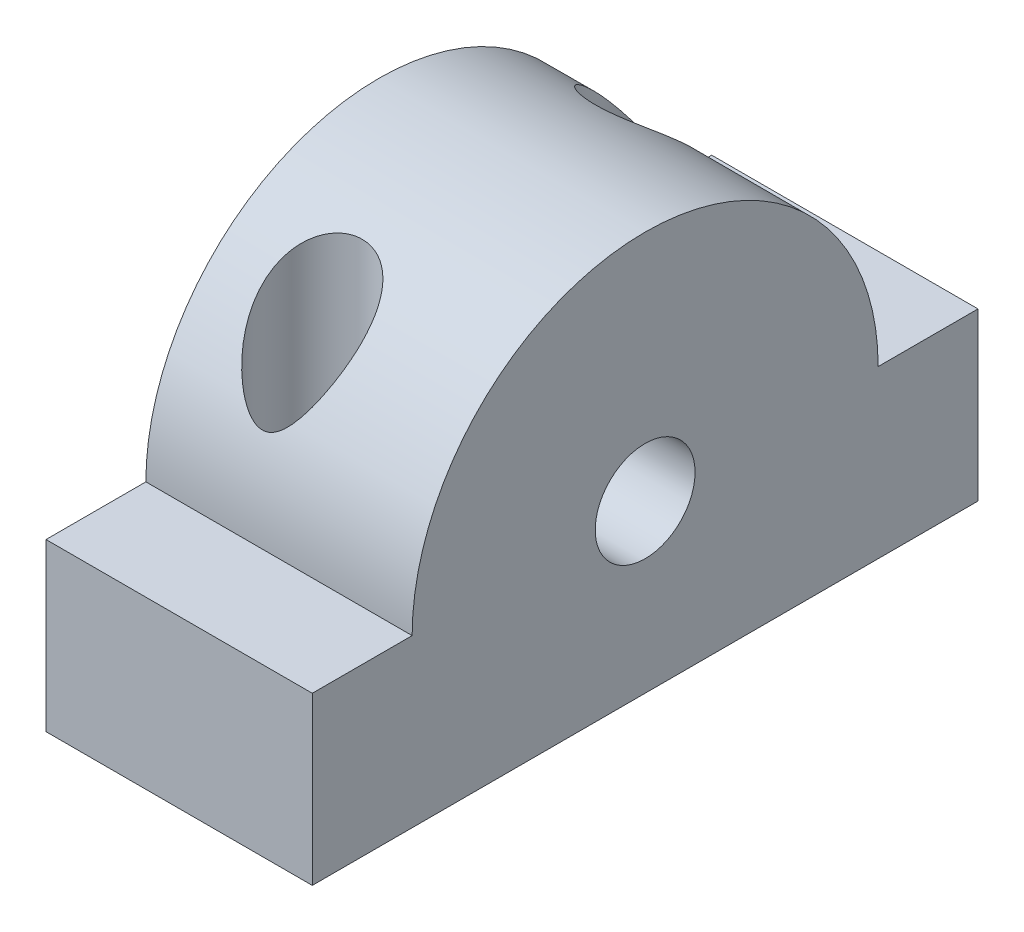
ISO-10303-21;
HEADER;
FILE_DESCRIPTION(('STEP AP214'),'2;1');
FILE_NAME('part.step','',(''),(''),'','','');
FILE_SCHEMA(('AUTOMOTIVE_DESIGN { 1 0 10303 214 1 1 1 1 }'));
ENDSEC;
DATA;
#1=APPLICATION_CONTEXT('core data for automotive mechanical design processes');
#2=APPLICATION_PROTOCOL_DEFINITION('international standard','automotive_design',2000,#1);
#3=PRODUCT_CONTEXT('',#1,'mechanical');
#4=PRODUCT('Part','Part','',(#3));
#5=PRODUCT_RELATED_PRODUCT_CATEGORY('part','',(#4));
#6=PRODUCT_DEFINITION_FORMATION('','',#4);
#7=PRODUCT_DEFINITION_CONTEXT('part definition',#1,'design');
#8=PRODUCT_DEFINITION('design','',#6,#7);
#9=PRODUCT_DEFINITION_SHAPE('','',#8);
#10=(LENGTH_UNIT() NAMED_UNIT(*) SI_UNIT(.MILLI.,.METRE.));
#11=(NAMED_UNIT(*) PLANE_ANGLE_UNIT() SI_UNIT($,.RADIAN.));
#12=(NAMED_UNIT(*) SI_UNIT($,.STERADIAN.) SOLID_ANGLE_UNIT());
#13=UNCERTAINTY_MEASURE_WITH_UNIT(LENGTH_MEASURE(1.E-05),#10,'distance_accuracy_value','');
#14=(GEOMETRIC_REPRESENTATION_CONTEXT(3) GLOBAL_UNCERTAINTY_ASSIGNED_CONTEXT((#13)) GLOBAL_UNIT_ASSIGNED_CONTEXT((#10,
#11,#12)) REPRESENTATION_CONTEXT('',''));
#15=CARTESIAN_POINT('',(0.,0.,0.));
#16=DIRECTION('',(0.,0.,1.));
#17=DIRECTION('',(1.,0.,0.));
#18=AXIS2_PLACEMENT_3D('',#15,#16,#17);
#19=CARTESIAN_POINT('',(8.,0.,0.));
#20=DIRECTION('',(0.,0.,-1.));
#21=DIRECTION('',(-1.,0.,0.));
#22=AXIS2_PLACEMENT_3D('',#19,#20,#21);
#23=PLANE('',#22);
#24=DIRECTION('',(0.,-1.,0.));
#25=VECTOR('',#24,1.);
#26=CARTESIAN_POINT('',(0.,0.,0.));
#27=LINE('',#26,#25);
#28=CARTESIAN_POINT('',(0.,0.,0.));
#29=VERTEX_POINT('',#28);
#30=CARTESIAN_POINT('',(0.,-5.,0.));
#31=VERTEX_POINT('',#30);
#32=EDGE_CURVE('E131',#29,#31,#27,.T.);
#33=ORIENTED_EDGE('',*,*,#32,.T.);
#34=DIRECTION('',(-1.,0.,0.));
#35=VECTOR('',#34,1.);
#36=CARTESIAN_POINT('',(8.,-5.,0.));
#37=LINE('',#36,#35);
#38=CARTESIAN_POINT('',(8.,-5.,0.));
#39=VERTEX_POINT('',#38);
#40=EDGE_CURVE('E11',#39,#31,#37,.T.);
#41=ORIENTED_EDGE('',*,*,#40,.F.);
#42=DIRECTION('',(0.,-1.,0.));
#43=VECTOR('',#42,1.);
#44=CARTESIAN_POINT('',(8.,0.,0.));
#45=LINE('',#44,#43);
#46=CARTESIAN_POINT('',(8.,0.,0.));
#47=VERTEX_POINT('',#46);
#48=EDGE_CURVE('E142',#47,#39,#45,.T.);
#49=ORIENTED_EDGE('',*,*,#48,.F.);
#50=DIRECTION('',(-1.,0.,0.));
#51=VECTOR('',#50,1.);
#52=CARTESIAN_POINT('',(8.,0.,0.));
#53=LINE('',#52,#51);
#54=EDGE_CURVE('E127',#47,#29,#53,.T.);
#55=ORIENTED_EDGE('',*,*,#54,.T.);
#56=EDGE_LOOP('',(#33,#41,#49,#55));
#57=FACE_BOUND('',#56,.T.);
#58=ADVANCED_FACE('F45',(#57),#23,.F.);
#59=CARTESIAN_POINT('',(8.,-5.,0.));
#60=DIRECTION('',(0.,1.,0.));
#61=DIRECTION('',(0.,0.,1.));
#62=AXIS2_PLACEMENT_3D('',#59,#60,#61);
#63=PLANE('',#62);
#64=CARTESIAN_POINT('',(3.,-5.,-5.));
#65=DIRECTION('',(0.,-1.,0.));
#66=DIRECTION('',(0.,0.,-1.));
#67=AXIS2_PLACEMENT_3D('',#64,#65,#66);
#68=CIRCLE('',#67,1.5);
#69=CARTESIAN_POINT('',(3.,-5.,-6.5));
#70=VERTEX_POINT('',#69);
#71=EDGE_CURVE('E155',#70,#70,#68,.T.);
#72=ORIENTED_EDGE('',*,*,#71,.F.);
#73=EDGE_LOOP('',(#72));
#74=FACE_BOUND('',#73,.T.);
#75=CARTESIAN_POINT('',(3.,-5.,-15.));
#76=DIRECTION('',(0.,-1.,0.));
#77=DIRECTION('',(0.,0.,1.));
#78=AXIS2_PLACEMENT_3D('',#75,#76,#77);
#79=CIRCLE('',#78,1.5);
#80=CARTESIAN_POINT('',(3.,-5.,-13.5));
#81=VERTEX_POINT('',#80);
#82=EDGE_CURVE('E202',#81,#81,#79,.T.);
#83=ORIENTED_EDGE('',*,*,#82,.F.);
#84=EDGE_LOOP('',(#83));
#85=FACE_BOUND('',#84,.T.);
#86=DIRECTION('',(0.,0.,-1.));
#87=VECTOR('',#86,1.);
#88=CARTESIAN_POINT('',(0.,-5.,0.));
#89=LINE('',#88,#87);
#90=CARTESIAN_POINT('',(0.,-5.,-20.));
#91=VERTEX_POINT('',#90);
#92=EDGE_CURVE('E134',#31,#91,#89,.T.);
#93=ORIENTED_EDGE('',*,*,#92,.T.);
#94=DIRECTION('',(-1.,0.,0.));
#95=VECTOR('',#94,1.);
#96=CARTESIAN_POINT('',(8.,-5.,-20.));
#97=LINE('',#96,#95);
#98=CARTESIAN_POINT('',(8.,-5.,-20.));
#99=VERTEX_POINT('',#98);
#100=EDGE_CURVE('E54',#99,#91,#97,.T.);
#101=ORIENTED_EDGE('',*,*,#100,.F.);
#102=DIRECTION('',(0.,0.,-1.));
#103=VECTOR('',#102,1.);
#104=CARTESIAN_POINT('',(8.,-5.,0.));
#105=LINE('',#104,#103);
#106=EDGE_CURVE('E100',#39,#99,#105,.T.);
#107=ORIENTED_EDGE('',*,*,#106,.F.);
#108=ORIENTED_EDGE('',*,*,#40,.T.);
#109=EDGE_LOOP('',(#93,#101,#107,#108));
#110=FACE_BOUND('',#109,.T.);
#111=ADVANCED_FACE('F186',(#74,#85,#110),#63,.F.);
#112=CARTESIAN_POINT('',(8.,0.,-20.));
#113=DIRECTION('',(0.,0.,1.));
#114=DIRECTION('',(1.,0.,0.));
#115=AXIS2_PLACEMENT_3D('',#112,#113,#114);
#116=PLANE('',#115);
#117=DIRECTION('',(0.,1.,0.));
#118=VECTOR('',#117,1.);
#119=CARTESIAN_POINT('',(0.,0.,-20.));
#120=LINE('',#119,#118);
#121=CARTESIAN_POINT('',(0.,0.,-20.));
#122=VERTEX_POINT('',#121);
#123=EDGE_CURVE('E137',#91,#122,#120,.T.);
#124=ORIENTED_EDGE('',*,*,#123,.T.);
#125=DIRECTION('',(-1.,0.,0.));
#126=VECTOR('',#125,1.);
#127=CARTESIAN_POINT('',(8.,0.,-20.));
#128=LINE('',#127,#126);
#129=CARTESIAN_POINT('',(8.,0.,-20.));
#130=VERTEX_POINT('',#129);
#131=EDGE_CURVE('E122',#130,#122,#128,.T.);
#132=ORIENTED_EDGE('',*,*,#131,.F.);
#133=DIRECTION('',(0.,1.,0.));
#134=VECTOR('',#133,1.);
#135=CARTESIAN_POINT('',(8.,0.,-20.));
#136=LINE('',#135,#134);
#137=EDGE_CURVE('E113',#99,#130,#136,.T.);
#138=ORIENTED_EDGE('',*,*,#137,.F.);
#139=ORIENTED_EDGE('',*,*,#100,.T.);
#140=EDGE_LOOP('',(#124,#132,#138,#139));
#141=FACE_BOUND('',#140,.T.);
#142=ADVANCED_FACE('F191',(#141),#116,.F.);
#143=CARTESIAN_POINT('',(8.,0.,-17.));
#144=DIRECTION('',(0.,-1.,0.));
#145=DIRECTION('',(0.,0.,-1.));
#146=AXIS2_PLACEMENT_3D('',#143,#144,#145);
#147=PLANE('',#146);
#148=DIRECTION('',(0.,0.,1.));
#149=VECTOR('',#148,1.);
#150=CARTESIAN_POINT('',(0.,0.,-17.));
#151=LINE('',#150,#149);
#152=CARTESIAN_POINT('',(0.,0.,-17.));
#153=VERTEX_POINT('',#152);
#154=EDGE_CURVE('E121',#122,#153,#151,.T.);
#155=ORIENTED_EDGE('',*,*,#154,.T.);
#156=DIRECTION('',(-1.,0.,0.));
#157=VECTOR('',#156,1.);
#158=CARTESIAN_POINT('',(8.,0.,-17.));
#159=LINE('',#158,#157);
#160=CARTESIAN_POINT('',(8.,0.,-17.));
#161=VERTEX_POINT('',#160);
#162=EDGE_CURVE('E118',#161,#153,#159,.T.);
#163=ORIENTED_EDGE('',*,*,#162,.F.);
#164=DIRECTION('',(0.,0.,1.));
#165=VECTOR('',#164,1.);
#166=CARTESIAN_POINT('',(8.,0.,-17.));
#167=LINE('',#166,#165);
#168=EDGE_CURVE('E107',#130,#161,#167,.T.);
#169=ORIENTED_EDGE('',*,*,#168,.F.);
#170=ORIENTED_EDGE('',*,*,#131,.T.);
#171=EDGE_LOOP('',(#155,#163,#169,#170));
#172=FACE_BOUND('',#171,.T.);
#173=ADVANCED_FACE('F119',(#172),#147,.F.);
#174=CARTESIAN_POINT('',(8.,0.,-10.));
#175=DIRECTION('',(-1.,0.,0.));
#176=DIRECTION('',(0.,0.,1.));
#177=AXIS2_PLACEMENT_3D('',#174,#175,#176);
#178=CYLINDRICAL_SURFACE('',#177,7.);
#179=CARTESIAN_POINT('',(3.,6.06217782649107,-6.5));
#180=CARTESIAN_POINT('',(3.07488724612899,6.06217677462976,-6.49999634374938));
#181=CARTESIAN_POINT('',(3.14988624091181,6.0589302713698,-6.49435644566424));
#182=CARTESIAN_POINT('',(3.29775974677453,6.0459724803858,-6.47205774478669));
#183=CARTESIAN_POINT('',(3.37062905275264,6.03624654463625,-6.45537397570824));
#184=CARTESIAN_POINT('',(3.51188865566737,6.01049479681937,-6.41188299750404));
#185=CARTESIAN_POINT('',(3.58029019650692,5.9944855713019,-6.38510244900321));
#186=CARTESIAN_POINT('',(3.71106599554074,5.95643101131848,-6.32273786800935));
#187=CARTESIAN_POINT('',(3.77344269810746,5.93438813883361,-6.28715742681158));
#188=CARTESIAN_POINT('',(3.89292525958971,5.88379941758364,-6.20748150702812));
#189=CARTESIAN_POINT('',(3.94978516839445,5.85506078959614,-6.1631411109325));
#190=CARTESIAN_POINT('',(4.05496144917599,5.79205373694304,-6.06867227857916));
#191=CARTESIAN_POINT('',(4.10327468693715,5.75778329243689,-6.01854173006338));
#192=CARTESIAN_POINT('',(4.19602252113023,5.68016067501728,-5.90844851594702));
#193=CARTESIAN_POINT('',(4.23940177401288,5.63621985297474,-5.84801495280211));
#194=CARTESIAN_POINT('',(4.315428429894,5.54312300713837,-5.72451251700034));
#195=CARTESIAN_POINT('',(4.34806891256743,5.49396364727133,-5.66144197439642));
#196=CARTESIAN_POINT('',(4.4167546955706,5.36613782400882,-5.50341581278758));
#197=CARTESIAN_POINT('',(4.44666359778181,5.2847950322343,-5.40794604740489));
#198=CARTESIAN_POINT('',(4.48702326248985,5.11482709893844,-5.21933503664093));
#199=CARTESIAN_POINT('',(4.49743163483481,5.02618652885623,-5.12619929722758));
#200=CARTESIAN_POINT('',(4.50104902374122,4.87255488254904,-4.97347088141769));
#201=CARTESIAN_POINT('',(4.49864351739466,4.80891094018342,-4.91255459865941));
#202=CARTESIAN_POINT('',(4.48691798287046,4.67971570857437,-4.79346831181909));
#203=CARTESIAN_POINT('',(4.4775975223072,4.61416430030517,-4.73529847971197));
#204=CARTESIAN_POINT('',(4.45273959729481,4.48154486847538,-4.6219540018488));
#205=CARTESIAN_POINT('',(4.43719432490148,4.41447504038028,-4.56678321695874));
#206=CARTESIAN_POINT('',(4.40045785583339,4.27931491601703,-4.45970247839746));
#207=CARTESIAN_POINT('',(4.37926743029367,4.21122476032494,-4.4077920805492));
#208=CARTESIAN_POINT('',(4.33095803210965,4.07240049920133,-4.30586401596733));
#209=CARTESIAN_POINT('',(4.30368372443732,4.00164732927497,-4.25594618178696));
#210=CARTESIAN_POINT('',(4.24386068990434,3.85989916659202,-4.15975035645615));
#211=CARTESIAN_POINT('',(4.21131180482271,3.78890416664384,-4.11347247455487));
#212=CARTESIAN_POINT('',(4.14098406635786,3.64716476638046,-4.02461879109314));
#213=CARTESIAN_POINT('',(4.10320460699923,3.57642039607669,-3.98204341940978));
#214=CARTESIAN_POINT('',(4.02220307231857,3.43591555156199,-3.90073146296065));
#215=CARTESIAN_POINT('',(3.97898388887663,3.36615457630842,-3.86199285789354));
#216=CARTESIAN_POINT('',(3.8798090265835,3.21864912727658,-3.78323181836819));
#217=CARTESIAN_POINT('',(3.82291578996759,3.14119045536872,-3.74381869853061));
#218=CARTESIAN_POINT('',(3.73015307569975,3.0291543535705,-3.68921869834723));
#219=CARTESIAN_POINT('',(3.6980432869428,2.99254753229684,-3.67179243844725));
#220=CARTESIAN_POINT('',(3.63088846263601,2.92134191886284,-3.63860900282595));
#221=CARTESIAN_POINT('',(3.59584586051998,2.88674150151201,-3.62285046746037));
#222=CARTESIAN_POINT('',(3.52621368996409,2.82409961021022,-3.59488413495186));
#223=CARTESIAN_POINT('',(3.4919823889331,2.79575315285715,-3.58247669824057));
#224=CARTESIAN_POINT('',(3.42022037285386,2.74257567142704,-3.5595719159984));
#225=CARTESIAN_POINT('',(3.38268960969438,2.71774469862497,-3.54907459832685));
#226=CARTESIAN_POINT('',(3.30970845793241,2.67662176252767,-3.53191530166755));
#227=CARTESIAN_POINT('',(3.27475031859164,2.65961299069627,-3.5249174757353));
#228=CARTESIAN_POINT('',(3.20230836225991,2.63104470432912,-3.51325622013703));
#229=CARTESIAN_POINT('',(3.16483069686261,2.61947243167818,-3.50858732344287));
#230=CARTESIAN_POINT('',(3.0952089702251,2.60481996245347,-3.50269560855217));
#231=CARTESIAN_POINT('',(3.06335642997214,2.60056698943998,-3.50099595542385));
#232=CARTESIAN_POINT('',(2.99933910055876,2.59722432840553,-3.49965923742424));
#233=CARTESIAN_POINT('',(2.96717445835228,2.59813231789171,-3.50002124478201));
#234=CARTESIAN_POINT('',(2.90358057557784,2.60498319234335,-3.50276409220987));
#235=CARTESIAN_POINT('',(2.87214961070624,2.61091271627619,-3.50513957494601));
#236=CARTESIAN_POINT('',(2.81063034627651,2.6271212596488,-3.5116789939386));
#237=CARTESIAN_POINT('',(2.78054349134558,2.63740484006335,-3.51584480567509));
#238=CARTESIAN_POINT('',(2.70467025281412,2.66859541178565,-3.52859978469833));
#239=CARTESIAN_POINT('',(2.66019365694696,2.69218272747631,-3.53834606009046));
#240=CARTESIAN_POINT('',(2.57554205170607,2.74507374800841,-3.56063684660925));
#241=CARTESIAN_POINT('',(2.53538239379682,2.77439687147958,-3.57319088474469));
#242=CARTESIAN_POINT('',(2.45948573723692,2.83614122989274,-3.60020151653892));
#243=CARTESIAN_POINT('',(2.42368526244188,2.86850146032465,-3.61462221700708));
#244=CARTESIAN_POINT('',(2.35512608722087,2.93557413784138,-3.64517737337876));
#245=CARTESIAN_POINT('',(2.32237043013347,2.97028887962106,-3.66131351008476));
#246=CARTESIAN_POINT('',(2.22784672329253,3.076902198012,-3.71200836267158));
#247=CARTESIAN_POINT('',(2.16994533282429,3.1511607865734,-3.74880665612383));
#248=CARTESIAN_POINT('',(2.06268566025289,3.30182194016055,-3.82706304267076));
#249=CARTESIAN_POINT('',(2.01324779920348,3.37819567002254,-3.868470903232));
#250=CARTESIAN_POINT('',(1.92107937133774,3.53238357932364,-3.95598416283341));
#251=CARTESIAN_POINT('',(1.8783543383305,3.6101988886912,-4.00209338641199));
#252=CARTESIAN_POINT('',(1.79919626586278,3.76636025693809,-4.09889929315403));
#253=CARTESIAN_POINT('',(1.76277306560236,3.84470695080468,-4.14960296500745));
#254=CARTESIAN_POINT('',(1.69633682046079,4.00112300924113,-4.25544329469505));
#255=CARTESIAN_POINT('',(1.66632350441654,4.07919238540515,-4.31057976486869));
#256=CARTESIAN_POINT('',(1.61211589215235,4.23724815399855,-4.42723445494009));
#257=CARTESIAN_POINT('',(1.58816787199091,4.31720335410463,-4.48891031997641));
#258=CARTESIAN_POINT('',(1.54824405880129,4.47558462474626,-4.61673887057073));
#259=CARTESIAN_POINT('',(1.53227106024319,4.55401015004254,-4.6828931161582));
#260=CARTESIAN_POINT('',(1.50936200764066,4.70831713386748,-4.8190454679915));
#261=CARTESIAN_POINT('',(1.50239117831629,4.78420727238715,-4.88902768741363));
#262=CARTESIAN_POINT('',(1.49863843931101,4.93289050511262,-5.03238060552076));
#263=CARTESIAN_POINT('',(1.50184662807992,5.00568653925189,-5.10574794292497));
#264=CARTESIAN_POINT('',(1.52091374724344,5.15515579980584,-5.26318733607478));
#265=CARTESIAN_POINT('',(1.53813153146209,5.23136847582664,-5.34754637445085));
#266=CARTESIAN_POINT('',(1.58912316647582,5.37723028160116,-5.5169387243532));
#267=CARTESIAN_POINT('',(1.62287537006836,5.44688785167307,-5.60197101162939));
#268=CARTESIAN_POINT('',(1.70151784950505,5.56666989577079,-5.75500515148338));
#269=CARTESIAN_POINT('',(1.74354030151497,5.61810209173191,-5.82344531584494));
#270=CARTESIAN_POINT('',(1.84092653707535,5.71401226899974,-5.95565545590606));
#271=CARTESIAN_POINT('',(1.89628675637939,5.75849210295658,-6.01942667336016));
#272=CARTESIAN_POINT('',(2.02064184686832,5.83965530391415,-6.13946516165303));
#273=CARTESIAN_POINT('',(2.08974186319276,5.87627371201284,-6.19566857957846));
#274=CARTESIAN_POINT('',(2.23990304282745,5.94021830878181,-6.29630129881475));
#275=CARTESIAN_POINT('',(2.32096036433081,5.96754747274355,-6.34073436909221));
#276=CARTESIAN_POINT('',(2.47987116638816,6.00895693056789,-6.40920510202472));
#277=CARTESIAN_POINT('',(2.55651755813275,6.02437504447831,-6.43525364661646));
#278=CARTESIAN_POINT('',(2.71396889650055,6.04754252519674,-6.47469655710258));
#279=CARTESIAN_POINT('',(2.79476046443728,6.05531510893048,-6.48812922754911));
#280=CARTESIAN_POINT('',(2.8967274773751,6.06020467445738,-6.49658466813937));
#281=CARTESIAN_POINT('',(2.91735185690542,6.06094418966186,-6.49786403155561));
#282=CARTESIAN_POINT('',(2.95864798383547,6.06193090940145,-6.49957219971063));
#283=CARTESIAN_POINT('',(2.97931973094305,6.06217811696476,-6.50000100968123));
#284=CARTESIAN_POINT('',(3.,6.06217782649107,-6.5));
#285=B_SPLINE_CURVE_WITH_KNOTS('',3,(#179,#180,#181,#182,#183,#184,#185,#186,#187,#188,#189,
#190,#191,#192,#193,#194,#195,#196,#197,#198,#199,#200,#201,#202,#203,#204,#205,#206,#207,#208,
#209,#210,#211,#212,#213,#214,#215,#216,#217,#218,#219,#220,#221,#222,#223,#224,#225,#226,#227,
#228,#229,#230,#231,#232,#233,#234,#235,#236,#237,#238,#239,#240,#241,#242,#243,#244,#245,#246,
#247,#248,#249,#250,#251,#252,#253,#254,#255,#256,#257,#258,#259,#260,#261,#262,#263,#264,#265,
#266,#267,#268,#269,#270,#271,#272,#273,#274,#275,#276,#277,#278,#279,#280,#281,#282,#283,#284),
.UNSPECIFIED.,.T.,.F.,(4,2,2,2,2,2,2,2,2,2,2,2,2,2,2,2,2,2,2,2,2,2,2,2,2,2,2,2,2,2,2,2,2,2,2,2,
2,2,2,2,2,2,2,2,2,2,2,2,2,2,2,2,4),(0.,0.22457800782261,0.449665448877575,0.674162660707472,
0.898568404462459,1.13047688297963,1.36247023093483,1.62068110586384,1.87905805371998,
2.26374806478361,2.6492733471073,2.91334183514724,3.1774268365345,3.44184412949029,
3.70622532121499,3.97834275049454,4.25046834396562,4.52262549030446,4.79463855809113,
5.10556994036694,5.260618189636,5.41553904295768,5.55376204682154,5.69198706652368,
5.81009396637873,5.92792229673463,6.02401377110962,6.12006200663358,6.21585548214175,
6.31174955276601,6.46469825078019,6.61817401138804,6.76904584855409,6.92006689828411,
7.22261802709004,7.52214618438217,7.82191998061111,8.12215767791002,8.42238267146595,
8.733336456753,9.04439912478951,9.35425653092469,9.66381261843944,10.0075777555188,
10.3508940261867,10.6358630365438,10.9207559790437,11.2079193729699,11.4949907032503,
11.7409004091011,11.9860610423969,12.048079108676,12.110096793477),.UNSPECIFIED.);
#286=CARTESIAN_POINT('',(3.,6.06217782649107,-6.5));
#287=VERTEX_POINT('',#286);
#288=EDGE_CURVE('E135',#287,#287,#285,.T.);
#289=ORIENTED_EDGE('',*,*,#288,.T.);
#290=EDGE_LOOP('',(#289));
#291=FACE_BOUND('',#290,.T.);
#292=CARTESIAN_POINT('',(3.,2.59807621135332,-16.5));
#293=CARTESIAN_POINT('',(3.03621051367618,2.59807496525115,-16.5000004540823));
#294=CARTESIAN_POINT('',(3.07241785881279,2.60140300638932,-16.4986731473966));
#295=CARTESIAN_POINT('',(3.14357448190675,2.61418551289894,-16.4935413053377));
#296=CARTESIAN_POINT('',(3.17852108564154,2.62365227556757,-16.4897317974599));
#297=CARTESIAN_POINT('',(3.25669192170981,2.65116177914567,-16.4785506494855));
#298=CARTESIAN_POINT('',(3.29918417145735,2.67094078008236,-16.4704463937216));
#299=CARTESIAN_POINT('',(3.38035006389322,2.71619722256609,-16.4515791497761));
#300=CARTESIAN_POINT('',(3.41901374265664,2.74168899739179,-16.4408094668504));
#301=CARTESIAN_POINT('',(3.49048151509668,2.79463402145742,-16.4180058312523));
#302=CARTESIAN_POINT('',(3.52350271653074,2.82185461251748,-16.4060982745087));
#303=CARTESIAN_POINT('',(3.586950243091,2.87856724435932,-16.3808165476753));
#304=CARTESIAN_POINT('',(3.61737416057911,2.90806134547999,-16.367441042513));
#305=CARTESIAN_POINT('',(3.70542908913123,2.99900557602951,-16.3253779734551));
#306=CARTESIAN_POINT('',(3.75971321275101,3.06281304457453,-16.2947981268239));
#307=CARTESIAN_POINT('',(3.86356677788234,3.19636190172221,-16.2280905819552));
#308=CARTESIAN_POINT('',(3.91283410906062,3.26624042091583,-16.1917811773674));
#309=CARTESIAN_POINT('',(4.00519245834409,3.40785019456434,-16.1149858417935));
#310=CARTESIAN_POINT('',(4.04827770985844,3.4795831061295,-16.0744960711481));
#311=CARTESIAN_POINT('',(4.12886103617834,3.6239423734971,-15.989496874301));
#312=CARTESIAN_POINT('',(4.16635158279676,3.69656979328237,-15.9449821591531));
#313=CARTESIAN_POINT('',(4.23585484147146,3.84196513785473,-15.8520721805626));
#314=CARTESIAN_POINT('',(4.2678673479677,3.91473306781082,-15.8036767715994));
#315=CARTESIAN_POINT('',(4.32829553646531,4.06485308268827,-15.6996375831466));
#316=CARTESIAN_POINT('',(4.35631582735112,4.14217854664856,-15.6437244678798));
#317=CARTESIAN_POINT('',(4.40554600661436,4.29585335225798,-15.5276504553148));
#318=CARTESIAN_POINT('',(4.42675393063864,4.37220240627555,-15.4674883389022));
#319=CARTESIAN_POINT('',(4.46160920714567,4.5231398068205,-15.3432880905423));
#320=CARTESIAN_POINT('',(4.47527655362799,4.59773230260351,-15.2792607130383));
#321=CARTESIAN_POINT('',(4.49420196776401,4.74469175114558,-15.1475850611513));
#322=CARTESIAN_POINT('',(4.49946533524619,4.81706007827239,-15.079939096613));
#323=CARTESIAN_POINT('',(4.50059007947848,4.97784209201204,-14.9230891596856));
#324=CARTESIAN_POINT('',(4.49357333499611,5.06539455078751,-14.8329427733898));
#325=CARTESIAN_POINT('',(4.46149685744455,5.23400759771309,-14.6497949913645));
#326=CARTESIAN_POINT('',(4.43645862974895,5.31507579565403,-14.5567971248796));
#327=CARTESIAN_POINT('',(4.37242216119916,5.45370090346652,-14.3893736931884));
#328=CARTESIAN_POINT('',(4.33705329804806,5.51277497616457,-14.3148295460633));
#329=CARTESIAN_POINT('',(4.25159700948248,5.62388923942213,-14.1689614829919));
#330=CARTESIAN_POINT('',(4.20152611035668,5.67593723248963,-14.0976340544865));
#331=CARTESIAN_POINT('',(4.09558570403978,5.76387656852717,-13.9727332848493));
#332=CARTESIAN_POINT('',(4.04195063301174,5.80101991346495,-13.918151121932));
#333=CARTESIAN_POINT('',(3.92448175394363,5.86858764094734,-13.8162046709244));
#334=CARTESIAN_POINT('',(3.86065063371275,5.89901378920964,-13.7688384870209));
#335=CARTESIAN_POINT('',(3.72362944621189,5.95261576708631,-13.6836025277306));
#336=CARTESIAN_POINT('',(3.65039187126331,5.97575257840507,-13.6457840665081));
#337=CARTESIAN_POINT('',(3.49689096881011,6.0140508063797,-13.5822595680155));
#338=CARTESIAN_POINT('',(3.41663029532259,6.02921522073835,-13.5565489784415));
#339=CARTESIAN_POINT('',(3.25994312667852,6.05019569036926,-13.5207271006035));
#340=CARTESIAN_POINT('',(3.18391009067779,6.05678137923209,-13.5093354405111));
#341=CARTESIAN_POINT('',(3.03072529175682,6.06313240764448,-13.4983524673046));
#342=CARTESIAN_POINT('',(2.9535739422618,6.06290020648474,-13.4987568992052));
#343=CARTESIAN_POINT('',(2.80410332805438,6.05579174032447,-13.5110438226328));
#344=CARTESIAN_POINT('',(2.7317249997686,6.04922147606881,-13.5223976706844));
#345=CARTESIAN_POINT('',(2.59016702208715,6.02997417127874,-13.5552454773784));
#346=CARTESIAN_POINT('',(2.52098716670026,6.01729752461575,-13.5767387820079));
#347=CARTESIAN_POINT('',(2.38681967294729,5.9858401759246,-13.6291397425305));
#348=CARTESIAN_POINT('',(2.32189010299547,5.96699024252345,-13.6601539124045));
#349=CARTESIAN_POINT('',(2.19855504496458,5.9235333580372,-13.7300726411811));
#350=CARTESIAN_POINT('',(2.14015085355286,5.89892526573551,-13.7689787639958));
#351=CARTESIAN_POINT('',(2.02726333174947,5.84256842790205,-13.8558055266851));
#352=CARTESIAN_POINT('',(1.97328892454207,5.8104570245609,-13.9041502201816));
#353=CARTESIAN_POINT('',(1.87446428649586,5.74077201715273,-14.0059134731183));
#354=CARTESIAN_POINT('',(1.82961720082735,5.70319653784911,-14.0593337722842));
#355=CARTESIAN_POINT('',(1.74394692586535,5.61811349238055,-14.176442533051));
#356=CARTESIAN_POINT('',(1.70437846311174,5.56995016087042,-14.2405690015771));
#357=CARTESIAN_POINT('',(1.63643966219784,5.4684894874897,-14.3706359185177));
#358=CARTESIAN_POINT('',(1.60807793821345,5.41518823529673,-14.4365777208249));
#359=CARTESIAN_POINT('',(1.54944310604014,5.2750472454677,-14.6033821167479));
#360=CARTESIAN_POINT('',(1.5260716589327,5.18536203217502,-14.7042943203941));
#361=CARTESIAN_POINT('',(1.49986410506026,4.99882149812191,-14.9020788861854));
#362=CARTESIAN_POINT('',(1.49706634363458,4.90195312844623,-14.9989433703888));
#363=CARTESIAN_POINT('',(1.50682702309573,4.73467986766722,-15.1567016659168));
#364=CARTESIAN_POINT('',(1.5148242448899,4.66555487358846,-15.2193118675536));
#365=CARTESIAN_POINT('',(1.5379952357137,4.52555313752582,-15.34115845944));
#366=CARTESIAN_POINT('',(1.55316938171101,4.45467630371196,-15.4003946722879));
#367=CARTESIAN_POINT('',(1.5900340568197,4.31145321169182,-15.51541832721));
#368=CARTESIAN_POINT('',(1.61174578042338,4.23910289879905,-15.5711938295939));
#369=CARTESIAN_POINT('',(1.66113478330926,4.09364118123522,-15.6789339962367));
#370=CARTESIAN_POINT('',(1.6888108006068,4.02052994067851,-15.7308994635481));
#371=CARTESIAN_POINT('',(1.7507048328144,3.87187032507609,-15.8324056321186));
#372=CARTESIAN_POINT('',(1.78509031754159,3.79631313859274,-15.8818311767394));
#373=CARTESIAN_POINT('',(1.85977061625643,3.64549167389362,-15.976479880802));
#374=CARTESIAN_POINT('',(1.90006488009677,3.57022736907757,-16.0217034308384));
#375=CARTESIAN_POINT('',(1.98664021817725,3.42117480604802,-16.1076121229977));
#376=CARTESIAN_POINT('',(2.03289031103307,3.34738104468649,-16.1483188521328));
#377=CARTESIAN_POINT('',(2.13229654968002,3.20217729106151,-16.2251723970959));
#378=CARTESIAN_POINT('',(2.18544319456698,3.13076418618187,-16.2613253537477));
#379=CARTESIAN_POINT('',(2.27849002802343,3.01893698386031,-16.3157178852992));
#380=CARTESIAN_POINT('',(2.31572312119137,2.97707795350088,-16.3355347509337));
#381=CARTESIAN_POINT('',(2.39431992155655,2.89606818613096,-16.3729724154557));
#382=CARTESIAN_POINT('',(2.43569333591872,2.85692419613535,-16.3905878249103));
#383=CARTESIAN_POINT('',(2.52401898670739,2.78266963916232,-16.4232711381));
#384=CARTESIAN_POINT('',(2.57104164301937,2.74762370697093,-16.4382996309634));
#385=CARTESIAN_POINT('',(2.6711476734699,2.68561510057034,-16.4644100106907));
#386=CARTESIAN_POINT('',(2.72419816679578,2.6586112307889,-16.4755120676854));
#387=CARTESIAN_POINT('',(2.81514277235624,2.6255032893693,-16.4889852835867));
#388=CARTESIAN_POINT('',(2.85127609209355,2.61535963901557,-16.4930690383621));
#389=CARTESIAN_POINT('',(2.92494309016771,2.60165451725676,-16.4985730163957));
#390=CARTESIAN_POINT('',(2.96247324662225,2.59807750275087,-16.499999529412));
#391=CARTESIAN_POINT('',(3.,2.59807621135332,-16.5));
#392=B_SPLINE_CURVE_WITH_KNOTS('',3,(#292,#293,#294,#295,#296,#297,#298,#299,#300,#301,#302,
#303,#304,#305,#306,#307,#308,#309,#310,#311,#312,#313,#314,#315,#316,#317,#318,#319,#320,#321,
#322,#323,#324,#325,#326,#327,#328,#329,#330,#331,#332,#333,#334,#335,#336,#337,#338,#339,#340,
#341,#342,#343,#344,#345,#346,#347,#348,#349,#350,#351,#352,#353,#354,#355,#356,#357,#358,#359,
#360,#361,#362,#363,#364,#365,#366,#367,#368,#369,#370,#371,#372,#373,#374,#375,#376,#377,#378,
#379,#380,#381,#382,#383,#384,#385,#386,#387,#388,#389,#390,#391),.UNSPECIFIED.,.T.,.F.,(4,2,2,
2,2,2,2,2,2,2,2,2,2,2,2,2,2,2,2,2,2,2,2,2,2,2,2,2,2,2,2,2,2,2,2,2,2,2,2,2,2,2,2,2,2,2,2,2,2,4),
(0.,0.108466171465434,0.217150300141978,0.359030969105363,0.501271681574416,0.634335404810715,
0.767521165989352,1.03440582986332,1.31273829173994,1.59132871504265,1.87029069104236,
2.14926313262222,2.44730315214392,2.74542903483261,3.04276058417915,3.33990455220469,
3.71620512174618,4.0920573876844,4.39533125304962,4.69826551045896,4.95238628806484,
5.20644018639788,5.46183174388353,5.71712720272502,5.94743839195851,6.17766650633998,
6.39730818700605,6.61693570233005,6.8391158151139,7.06133999939945,7.29814938754409,
7.53504023983718,7.80232781361206,8.06982044293218,8.47858807082093,8.8881173692395,
9.16859603470506,9.44908943393826,9.73050215236035,10.0118553850373,10.3014264836021,
10.590970638237,10.8790652607177,11.1667671269797,11.3448632910598,11.5233872534032,
11.7044277539277,11.8845242572843,11.9972001840644,12.1096090635078),.UNSPECIFIED.);
#393=CARTESIAN_POINT('',(3.,2.59807621135332,-16.5));
#394=VERTEX_POINT('',#393);
#395=EDGE_CURVE('E148',#394,#394,#392,.T.);
#396=ORIENTED_EDGE('',*,*,#395,.T.);
#397=EDGE_LOOP('',(#396));
#398=FACE_BOUND('',#397,.T.);
#399=CARTESIAN_POINT('',(0.,0.,-10.));
#400=DIRECTION('',(1.,0.,0.));
#401=DIRECTION('',(0.,0.,-1.));
#402=AXIS2_PLACEMENT_3D('',#399,#400,#401);
#403=CIRCLE('',#402,7.);
#404=CARTESIAN_POINT('',(0.,0.,-3.));
#405=VERTEX_POINT('',#404);
#406=EDGE_CURVE('E86',#153,#405,#403,.T.);
#407=ORIENTED_EDGE('',*,*,#406,.T.);
#408=DIRECTION('',(-1.,0.,0.));
#409=VECTOR('',#408,1.);
#410=CARTESIAN_POINT('',(8.,0.,-3.));
#411=LINE('',#410,#409);
#412=CARTESIAN_POINT('',(8.,0.,-3.));
#413=VERTEX_POINT('',#412);
#414=EDGE_CURVE('E123',#413,#405,#411,.T.);
#415=ORIENTED_EDGE('',*,*,#414,.F.);
#416=CARTESIAN_POINT('',(8.,0.,-10.));
#417=DIRECTION('',(1.,0.,0.));
#418=DIRECTION('',(0.,0.,-1.));
#419=AXIS2_PLACEMENT_3D('',#416,#417,#418);
#420=CIRCLE('',#419,7.);
#421=EDGE_CURVE('E111',#161,#413,#420,.T.);
#422=ORIENTED_EDGE('',*,*,#421,.F.);
#423=ORIENTED_EDGE('',*,*,#162,.T.);
#424=EDGE_LOOP('',(#407,#415,#422,#423));
#425=FACE_BOUND('',#424,.T.);
#426=ADVANCED_FACE('F125',(#291,#398,#425),#178,.T.);
#427=CARTESIAN_POINT('',(8.,0.,0.));
#428=DIRECTION('',(0.,-1.,0.));
#429=DIRECTION('',(0.,0.,-1.));
#430=AXIS2_PLACEMENT_3D('',#427,#428,#429);
#431=PLANE('',#430);
#432=DIRECTION('',(0.,0.,1.));
#433=VECTOR('',#432,1.);
#434=CARTESIAN_POINT('',(0.,0.,0.));
#435=LINE('',#434,#433);
#436=EDGE_CURVE('E92',#405,#29,#435,.T.);
#437=ORIENTED_EDGE('',*,*,#436,.T.);
#438=ORIENTED_EDGE('',*,*,#54,.F.);
#439=DIRECTION('',(0.,0.,1.));
#440=VECTOR('',#439,1.);
#441=CARTESIAN_POINT('',(8.,0.,0.));
#442=LINE('',#441,#440);
#443=EDGE_CURVE('E63',#413,#47,#442,.T.);
#444=ORIENTED_EDGE('',*,*,#443,.F.);
#445=ORIENTED_EDGE('',*,*,#414,.T.);
#446=EDGE_LOOP('',(#437,#438,#444,#445));
#447=FACE_BOUND('',#446,.T.);
#448=ADVANCED_FACE('F174',(#447),#431,.F.);
#449=CARTESIAN_POINT('',(8.,0.,-10.));
#450=DIRECTION('',(1.,0.,0.));
#451=DIRECTION('',(0.,0.,-1.));
#452=AXIS2_PLACEMENT_3D('',#449,#450,#451);
#453=PLANE('',#452);
#454=CARTESIAN_POINT('',(8.,0.,-10.));
#455=DIRECTION('',(1.,0.,0.));
#456=DIRECTION('',(0.,0.,-1.));
#457=AXIS2_PLACEMENT_3D('',#454,#455,#456);
#458=CIRCLE('',#457,1.5);
#459=CARTESIAN_POINT('',(8.,0.,-11.5));
#460=VERTEX_POINT('',#459);
#461=EDGE_CURVE('E207',#460,#460,#458,.T.);
#462=ORIENTED_EDGE('',*,*,#461,.F.);
#463=EDGE_LOOP('',(#462));
#464=FACE_BOUND('',#463,.T.);
#465=ORIENTED_EDGE('',*,*,#48,.T.);
#466=ORIENTED_EDGE('',*,*,#106,.T.);
#467=ORIENTED_EDGE('',*,*,#137,.T.);
#468=ORIENTED_EDGE('',*,*,#168,.T.);
#469=ORIENTED_EDGE('',*,*,#421,.T.);
#470=ORIENTED_EDGE('',*,*,#443,.T.);
#471=EDGE_LOOP('',(#465,#466,#467,#468,#469,#470));
#472=FACE_BOUND('',#471,.T.);
#473=ADVANCED_FACE('F109',(#464,#472),#453,.T.);
#474=CARTESIAN_POINT('',(0.,0.,-10.));
#475=DIRECTION('',(1.,0.,0.));
#476=DIRECTION('',(0.,0.,-1.));
#477=AXIS2_PLACEMENT_3D('',#474,#475,#476);
#478=PLANE('',#477);
#479=CARTESIAN_POINT('',(0.,0.,-10.));
#480=DIRECTION('',(1.,0.,0.));
#481=DIRECTION('',(0.,0.,-1.));
#482=AXIS2_PLACEMENT_3D('',#479,#480,#481);
#483=CIRCLE('',#482,1.5);
#484=CARTESIAN_POINT('',(0.,0.,-11.5));
#485=VERTEX_POINT('',#484);
#486=EDGE_CURVE('E48',#485,#485,#483,.T.);
#487=ORIENTED_EDGE('',*,*,#486,.T.);
#488=EDGE_LOOP('',(#487));
#489=FACE_BOUND('',#488,.T.);
#490=ORIENTED_EDGE('',*,*,#32,.F.);
#491=ORIENTED_EDGE('',*,*,#436,.F.);
#492=ORIENTED_EDGE('',*,*,#406,.F.);
#493=ORIENTED_EDGE('',*,*,#154,.F.);
#494=ORIENTED_EDGE('',*,*,#123,.F.);
#495=ORIENTED_EDGE('',*,*,#92,.F.);
#496=EDGE_LOOP('',(#490,#491,#492,#493,#494,#495));
#497=FACE_BOUND('',#496,.T.);
#498=ADVANCED_FACE('F168',(#489,#497),#478,.F.);
#499=CARTESIAN_POINT('',(3.,10.,-15.));
#500=DIRECTION('',(0.,-1.,0.));
#501=DIRECTION('',(0.,0.,-1.));
#502=AXIS2_PLACEMENT_3D('',#499,#500,#501);
#503=CYLINDRICAL_SURFACE('',#502,1.5);
#504=ORIENTED_EDGE('',*,*,#82,.T.);
#505=EDGE_LOOP('',(#504));
#506=FACE_BOUND('',#505,.T.);
#507=ORIENTED_EDGE('',*,*,#395,.F.);
#508=EDGE_LOOP('',(#507));
#509=FACE_BOUND('',#508,.T.);
#510=ADVANCED_FACE('F163',(#506,#509),#503,.F.);
#511=CARTESIAN_POINT('',(3.,10.,-5.));
#512=DIRECTION('',(0.,-1.,0.));
#513=DIRECTION('',(0.,0.,-1.));
#514=AXIS2_PLACEMENT_3D('',#511,#512,#513);
#515=CYLINDRICAL_SURFACE('',#514,1.5);
#516=ORIENTED_EDGE('',*,*,#71,.T.);
#517=EDGE_LOOP('',(#516));
#518=FACE_BOUND('',#517,.T.);
#519=ORIENTED_EDGE('',*,*,#288,.F.);
#520=EDGE_LOOP('',(#519));
#521=FACE_BOUND('',#520,.T.);
#522=ADVANCED_FACE('F167',(#518,#521),#515,.F.);
#523=CARTESIAN_POINT('',(-2.,0.,-10.));
#524=DIRECTION('',(1.,0.,0.));
#525=DIRECTION('',(0.,0.,-1.));
#526=AXIS2_PLACEMENT_3D('',#523,#524,#525);
#527=CYLINDRICAL_SURFACE('',#526,1.5);
#528=ORIENTED_EDGE('',*,*,#461,.T.);
#529=EDGE_LOOP('',(#528));
#530=FACE_BOUND('',#529,.T.);
#531=ORIENTED_EDGE('',*,*,#486,.F.);
#532=EDGE_LOOP('',(#531));
#533=FACE_BOUND('',#532,.T.);
#534=ADVANCED_FACE('F214',(#530,#533),#527,.F.);
#535=CLOSED_SHELL('',(#58,#111,#142,#173,#426,#448,#473,#498,#510,#522,#534));
#536=MANIFOLD_SOLID_BREP('B2',#535);
#537=ADVANCED_BREP_SHAPE_REPRESENTATION('',(#18,#536),#14);
#538=SHAPE_DEFINITION_REPRESENTATION(#9,#537);
ENDSEC;
END-ISO-10303-21;
